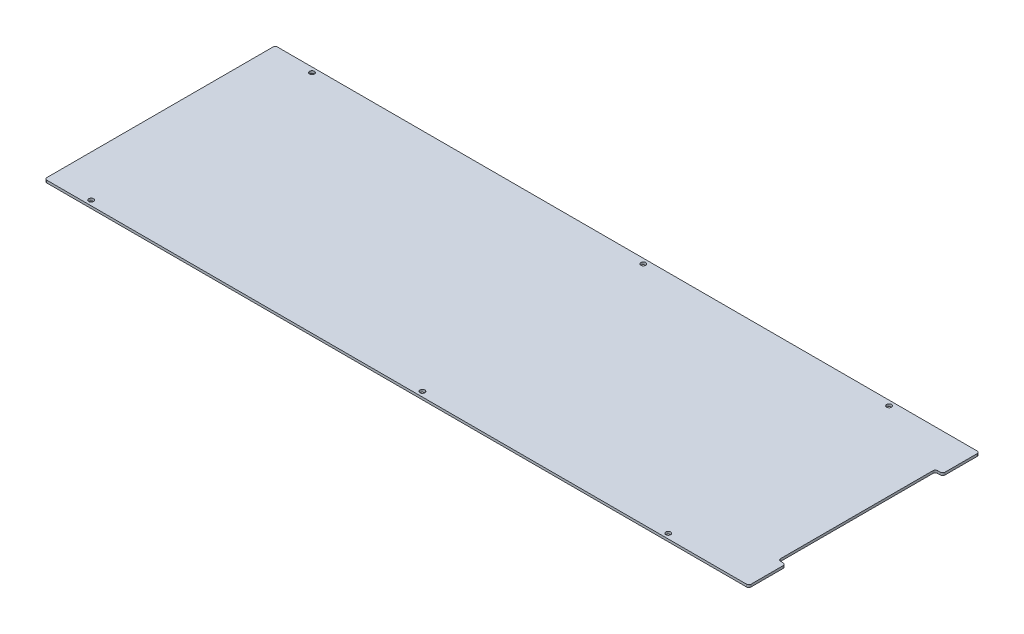
ISO-10303-21;
HEADER;
FILE_DESCRIPTION(('STEP AP214'),'2;1');
FILE_NAME('part.step','',(''),(''),'','','');
FILE_SCHEMA(('AUTOMOTIVE_DESIGN { 1 0 10303 214 1 1 1 1 }'));
ENDSEC;
DATA;
#1=APPLICATION_CONTEXT('core data for automotive mechanical design processes');
#2=APPLICATION_PROTOCOL_DEFINITION('international standard','automotive_design',2000,#1);
#3=PRODUCT_CONTEXT('',#1,'mechanical');
#4=PRODUCT('Part','Part','',(#3));
#5=PRODUCT_RELATED_PRODUCT_CATEGORY('part','',(#4));
#6=PRODUCT_DEFINITION_FORMATION('','',#4);
#7=PRODUCT_DEFINITION_CONTEXT('part definition',#1,'design');
#8=PRODUCT_DEFINITION('design','',#6,#7);
#9=PRODUCT_DEFINITION_SHAPE('','',#8);
#10=(LENGTH_UNIT() NAMED_UNIT(*) SI_UNIT(.MILLI.,.METRE.));
#11=(NAMED_UNIT(*) PLANE_ANGLE_UNIT() SI_UNIT($,.RADIAN.));
#12=(NAMED_UNIT(*) SI_UNIT($,.STERADIAN.) SOLID_ANGLE_UNIT());
#13=UNCERTAINTY_MEASURE_WITH_UNIT(LENGTH_MEASURE(1.E-05),#10,'distance_accuracy_value','');
#14=(GEOMETRIC_REPRESENTATION_CONTEXT(3) GLOBAL_UNCERTAINTY_ASSIGNED_CONTEXT((#13)) GLOBAL_UNIT_ASSIGNED_CONTEXT((#10,
#11,#12)) REPRESENTATION_CONTEXT('',''));
#15=CARTESIAN_POINT('',(0.,0.,0.));
#16=DIRECTION('',(0.,0.,1.));
#17=DIRECTION('',(1.,0.,0.));
#18=AXIS2_PLACEMENT_3D('',#15,#16,#17);
#19=CARTESIAN_POINT('',(455.6125,3.175,149.225));
#20=DIRECTION('',(-1.,0.,0.));
#21=DIRECTION('',(0.,0.,1.));
#22=AXIS2_PLACEMENT_3D('',#19,#20,#21);
#23=PLANE('',#22);
#24=DIRECTION('',(0.,0.,-1.));
#25=VECTOR('',#24,1.);
#26=CARTESIAN_POINT('',(455.6125,3.175,149.225));
#27=LINE('',#26,#25);
#28=CARTESIAN_POINT('',(455.6125,3.175,146.05));
#29=VERTEX_POINT('',#28);
#30=CARTESIAN_POINT('',(455.6125,3.175,104.775));
#31=VERTEX_POINT('',#30);
#32=EDGE_CURVE('E223',#29,#31,#27,.T.);
#33=ORIENTED_EDGE('',*,*,#32,.F.);
#34=DIRECTION('',(0.,-1.,0.));
#35=VECTOR('',#34,1.);
#36=CARTESIAN_POINT('',(455.6125,3.175,146.05));
#37=LINE('',#36,#35);
#38=CARTESIAN_POINT('',(455.6125,0.,146.05));
#39=VERTEX_POINT('',#38);
#40=EDGE_CURVE('E324',#29,#39,#37,.T.);
#41=ORIENTED_EDGE('',*,*,#40,.T.);
#42=DIRECTION('',(0.,0.,-1.));
#43=VECTOR('',#42,1.);
#44=CARTESIAN_POINT('',(455.6125,0.,149.225));
#45=LINE('',#44,#43);
#46=CARTESIAN_POINT('',(455.6125,0.,104.775));
#47=VERTEX_POINT('',#46);
#48=EDGE_CURVE('E238',#39,#47,#45,.T.);
#49=ORIENTED_EDGE('',*,*,#48,.T.);
#50=DIRECTION('',(0.,1.,0.));
#51=VECTOR('',#50,1.);
#52=CARTESIAN_POINT('',(455.6125,3.175,104.775));
#53=LINE('',#52,#51);
#54=EDGE_CURVE('E320',#47,#31,#53,.T.);
#55=ORIENTED_EDGE('',*,*,#54,.T.);
#56=EDGE_LOOP('',(#33,#41,#49,#55));
#57=FACE_BOUND('',#56,.T.);
#58=ADVANCED_FACE('F63',(#57),#23,.F.);
#59=CARTESIAN_POINT('',(455.6125,3.175,-104.775));
#60=VERTEX_POINT('',#59);
#61=CARTESIAN_POINT('',(455.6125,3.175,-146.05));
#62=VERTEX_POINT('',#61);
#63=EDGE_CURVE('E220',#60,#62,#27,.T.);
#64=ORIENTED_EDGE('',*,*,#63,.F.);
#65=DIRECTION('',(0.,1.,0.));
#66=VECTOR('',#65,1.);
#67=CARTESIAN_POINT('',(455.6125,3.175,-104.775));
#68=LINE('',#67,#66);
#69=CARTESIAN_POINT('',(455.6125,0.,-104.775));
#70=VERTEX_POINT('',#69);
#71=EDGE_CURVE('E12',#60,#70,#68,.F.);
#72=ORIENTED_EDGE('',*,*,#71,.T.);
#73=CARTESIAN_POINT('',(455.6125,0.,-146.05));
#74=VERTEX_POINT('',#73);
#75=EDGE_CURVE('E234',#70,#74,#45,.T.);
#76=ORIENTED_EDGE('',*,*,#75,.T.);
#77=DIRECTION('',(0.,-1.,0.));
#78=VECTOR('',#77,1.);
#79=CARTESIAN_POINT('',(455.6125,3.175,-146.05));
#80=LINE('',#79,#78);
#81=EDGE_CURVE('E72',#74,#62,#80,.F.);
#82=ORIENTED_EDGE('',*,*,#81,.T.);
#83=EDGE_LOOP('',(#64,#72,#76,#82));
#84=FACE_BOUND('',#83,.T.);
#85=ADVANCED_FACE('F339',(#84),#23,.F.);
#86=CARTESIAN_POINT('',(-455.6125,3.175,-149.225));
#87=DIRECTION('',(0.,0.,1.));
#88=DIRECTION('',(1.,0.,0.));
#89=AXIS2_PLACEMENT_3D('',#86,#87,#88);
#90=PLANE('',#89);
#91=DIRECTION('',(-1.,0.,0.));
#92=VECTOR('',#91,1.);
#93=CARTESIAN_POINT('',(-455.6125,0.,-149.225));
#94=LINE('',#93,#92);
#95=CARTESIAN_POINT('',(452.4375,0.,-149.225));
#96=VERTEX_POINT('',#95);
#97=CARTESIAN_POINT('',(-452.4375,0.,-149.225));
#98=VERTEX_POINT('',#97);
#99=EDGE_CURVE('E239',#96,#98,#94,.T.);
#100=ORIENTED_EDGE('',*,*,#99,.T.);
#101=DIRECTION('',(0.,-1.,0.));
#102=VECTOR('',#101,1.);
#103=CARTESIAN_POINT('',(-452.4375,3.175,-149.225));
#104=LINE('',#103,#102);
#105=CARTESIAN_POINT('',(-452.4375,3.175,-149.225));
#106=VERTEX_POINT('',#105);
#107=EDGE_CURVE('E79',#98,#106,#104,.F.);
#108=ORIENTED_EDGE('',*,*,#107,.T.);
#109=DIRECTION('',(-1.,0.,0.));
#110=VECTOR('',#109,1.);
#111=CARTESIAN_POINT('',(-455.6125,3.175,-149.225));
#112=LINE('',#111,#110);
#113=CARTESIAN_POINT('',(452.4375,3.175,-149.225));
#114=VERTEX_POINT('',#113);
#115=EDGE_CURVE('E225',#114,#106,#112,.T.);
#116=ORIENTED_EDGE('',*,*,#115,.F.);
#117=DIRECTION('',(0.,-1.,0.));
#118=VECTOR('',#117,1.);
#119=CARTESIAN_POINT('',(452.4375,3.175,-149.225));
#120=LINE('',#119,#118);
#121=EDGE_CURVE('E314',#114,#96,#120,.T.);
#122=ORIENTED_EDGE('',*,*,#121,.T.);
#123=EDGE_LOOP('',(#100,#108,#116,#122));
#124=FACE_BOUND('',#123,.T.);
#125=ADVANCED_FACE('F346',(#124),#90,.F.);
#126=CARTESIAN_POINT('',(-455.6125,3.175,149.225));
#127=DIRECTION('',(1.,0.,0.));
#128=DIRECTION('',(0.,0.,-1.));
#129=AXIS2_PLACEMENT_3D('',#126,#127,#128);
#130=PLANE('',#129);
#131=DIRECTION('',(0.,0.,1.));
#132=VECTOR('',#131,1.);
#133=CARTESIAN_POINT('',(-455.6125,0.,149.225));
#134=LINE('',#133,#132);
#135=CARTESIAN_POINT('',(-455.6125,0.,-146.05));
#136=VERTEX_POINT('',#135);
#137=CARTESIAN_POINT('',(-455.6125,0.,146.05));
#138=VERTEX_POINT('',#137);
#139=EDGE_CURVE('E242',#136,#138,#134,.T.);
#140=ORIENTED_EDGE('',*,*,#139,.T.);
#141=DIRECTION('',(0.,-1.,0.));
#142=VECTOR('',#141,1.);
#143=CARTESIAN_POINT('',(-455.6125,3.175,146.05));
#144=LINE('',#143,#142);
#145=CARTESIAN_POINT('',(-455.6125,3.175,146.05));
#146=VERTEX_POINT('',#145);
#147=EDGE_CURVE('E295',#138,#146,#144,.F.);
#148=ORIENTED_EDGE('',*,*,#147,.T.);
#149=DIRECTION('',(0.,0.,1.));
#150=VECTOR('',#149,1.);
#151=CARTESIAN_POINT('',(-455.6125,3.175,149.225));
#152=LINE('',#151,#150);
#153=CARTESIAN_POINT('',(-455.6125,3.175,-146.05));
#154=VERTEX_POINT('',#153);
#155=EDGE_CURVE('E228',#154,#146,#152,.T.);
#156=ORIENTED_EDGE('',*,*,#155,.F.);
#157=DIRECTION('',(0.,-1.,0.));
#158=VECTOR('',#157,1.);
#159=CARTESIAN_POINT('',(-455.6125,3.175,-146.05));
#160=LINE('',#159,#158);
#161=EDGE_CURVE('E291',#154,#136,#160,.T.);
#162=ORIENTED_EDGE('',*,*,#161,.T.);
#163=EDGE_LOOP('',(#140,#148,#156,#162));
#164=FACE_BOUND('',#163,.T.);
#165=ADVANCED_FACE('F357',(#164),#130,.F.);
#166=CARTESIAN_POINT('',(-455.6125,3.175,149.225));
#167=DIRECTION('',(0.,0.,-1.));
#168=DIRECTION('',(-1.,0.,0.));
#169=AXIS2_PLACEMENT_3D('',#166,#167,#168);
#170=PLANE('',#169);
#171=DIRECTION('',(1.,0.,0.));
#172=VECTOR('',#171,1.);
#173=CARTESIAN_POINT('',(-455.6125,3.175,149.225));
#174=LINE('',#173,#172);
#175=CARTESIAN_POINT('',(-452.4375,3.175,149.225));
#176=VERTEX_POINT('',#175);
#177=CARTESIAN_POINT('',(452.4375,3.175,149.225));
#178=VERTEX_POINT('',#177);
#179=EDGE_CURVE('E201',#176,#178,#174,.T.);
#180=ORIENTED_EDGE('',*,*,#179,.F.);
#181=DIRECTION('',(0.,-1.,0.));
#182=VECTOR('',#181,1.);
#183=CARTESIAN_POINT('',(-452.4375,3.175,149.225));
#184=LINE('',#183,#182);
#185=CARTESIAN_POINT('',(-452.4375,0.,149.225));
#186=VERTEX_POINT('',#185);
#187=EDGE_CURVE('E269',#176,#186,#184,.T.);
#188=ORIENTED_EDGE('',*,*,#187,.T.);
#189=DIRECTION('',(1.,0.,0.));
#190=VECTOR('',#189,1.);
#191=CARTESIAN_POINT('',(-455.6125,0.,149.225));
#192=LINE('',#191,#190);
#193=CARTESIAN_POINT('',(452.4375,0.,149.225));
#194=VERTEX_POINT('',#193);
#195=EDGE_CURVE('E224',#186,#194,#192,.T.);
#196=ORIENTED_EDGE('',*,*,#195,.T.);
#197=DIRECTION('',(0.,-1.,0.));
#198=VECTOR('',#197,1.);
#199=CARTESIAN_POINT('',(452.4375,3.175,149.225));
#200=LINE('',#199,#198);
#201=EDGE_CURVE('E266',#194,#178,#200,.F.);
#202=ORIENTED_EDGE('',*,*,#201,.T.);
#203=EDGE_LOOP('',(#180,#188,#196,#202));
#204=FACE_BOUND('',#203,.T.);
#205=ADVANCED_FACE('F365',(#204),#170,.F.);
#206=CARTESIAN_POINT('',(0.,3.175,0.));
#207=DIRECTION('',(0.,-1.,0.));
#208=DIRECTION('',(0.,0.,-1.));
#209=AXIS2_PLACEMENT_3D('',#206,#207,#208);
#210=PLANE('',#209);
#211=CARTESIAN_POINT('',(345.04884,3.175,142.875));
#212=DIRECTION('',(0.,-1.,0.));
#213=DIRECTION('',(0.,0.,-1.));
#214=AXIS2_PLACEMENT_3D('',#211,#212,#213);
#215=CIRCLE('',#214,3.17499999999998);
#216=CARTESIAN_POINT('',(345.04884,3.175,139.7));
#217=VERTEX_POINT('',#216);
#218=EDGE_CURVE('E442',#217,#217,#215,.T.);
#219=ORIENTED_EDGE('',*,*,#218,.T.);
#220=EDGE_LOOP('',(#219));
#221=FACE_BOUND('',#220,.T.);
#222=CARTESIAN_POINT('',(-401.6375,3.175,142.875));
#223=DIRECTION('',(0.,-1.,0.));
#224=DIRECTION('',(0.,0.,-1.));
#225=AXIS2_PLACEMENT_3D('',#222,#223,#224);
#226=CIRCLE('',#225,3.17499999999998);
#227=CARTESIAN_POINT('',(-401.6375,3.175,139.7));
#228=VERTEX_POINT('',#227);
#229=EDGE_CURVE('E434',#228,#228,#226,.T.);
#230=ORIENTED_EDGE('',*,*,#229,.T.);
#231=EDGE_LOOP('',(#230));
#232=FACE_BOUND('',#231,.T.);
#233=CARTESIAN_POINT('',(26.9875000000001,3.175,142.875));
#234=DIRECTION('',(0.,-1.,0.));
#235=DIRECTION('',(0.,0.,-1.));
#236=AXIS2_PLACEMENT_3D('',#233,#234,#235);
#237=CIRCLE('',#236,3.175);
#238=CARTESIAN_POINT('',(26.9875000000001,3.175,139.7));
#239=VERTEX_POINT('',#238);
#240=EDGE_CURVE('E426',#239,#239,#237,.T.);
#241=ORIENTED_EDGE('',*,*,#240,.T.);
#242=EDGE_LOOP('',(#241));
#243=FACE_BOUND('',#242,.T.);
#244=CARTESIAN_POINT('',(345.04884,3.175,-142.875));
#245=DIRECTION('',(0.,-1.,0.));
#246=DIRECTION('',(0.,0.,-1.));
#247=AXIS2_PLACEMENT_3D('',#244,#245,#246);
#248=CIRCLE('',#247,3.17499999999998);
#249=CARTESIAN_POINT('',(345.04884,3.175,-146.05));
#250=VERTEX_POINT('',#249);
#251=EDGE_CURVE('E418',#250,#250,#248,.T.);
#252=ORIENTED_EDGE('',*,*,#251,.T.);
#253=EDGE_LOOP('',(#252));
#254=FACE_BOUND('',#253,.T.);
#255=CARTESIAN_POINT('',(-401.6375,3.175,-142.875));
#256=DIRECTION('',(0.,-1.,0.));
#257=DIRECTION('',(0.,0.,-1.));
#258=AXIS2_PLACEMENT_3D('',#255,#256,#257);
#259=CIRCLE('',#258,3.17499999999998);
#260=CARTESIAN_POINT('',(-401.6375,3.175,-146.05));
#261=VERTEX_POINT('',#260);
#262=EDGE_CURVE('E408',#261,#261,#259,.T.);
#263=ORIENTED_EDGE('',*,*,#262,.T.);
#264=EDGE_LOOP('',(#263));
#265=FACE_BOUND('',#264,.T.);
#266=CARTESIAN_POINT('',(26.9875000000001,3.175,-142.875));
#267=DIRECTION('',(0.,-1.,0.));
#268=DIRECTION('',(0.,0.,-1.));
#269=AXIS2_PLACEMENT_3D('',#266,#267,#268);
#270=CIRCLE('',#269,3.175);
#271=CARTESIAN_POINT('',(26.9875000000001,3.175,-146.05));
#272=VERTEX_POINT('',#271);
#273=EDGE_CURVE('E397',#272,#272,#270,.T.);
#274=ORIENTED_EDGE('',*,*,#273,.T.);
#275=EDGE_LOOP('',(#274));
#276=FACE_BOUND('',#275,.T.);
#277=ORIENTED_EDGE('',*,*,#155,.T.);
#278=CARTESIAN_POINT('',(-452.4375,3.175,146.05));
#279=DIRECTION('',(0.,-1.,0.));
#280=DIRECTION('',(0.,0.,-1.));
#281=AXIS2_PLACEMENT_3D('',#278,#279,#280);
#282=CIRCLE('',#281,3.175);
#283=EDGE_CURVE('E311',#146,#176,#282,.F.);
#284=ORIENTED_EDGE('',*,*,#283,.T.);
#285=ORIENTED_EDGE('',*,*,#179,.T.);
#286=CARTESIAN_POINT('',(452.4375,3.175,146.05));
#287=DIRECTION('',(0.,-1.,0.));
#288=DIRECTION('',(0.,0.,-1.));
#289=AXIS2_PLACEMENT_3D('',#286,#287,#288);
#290=CIRCLE('',#289,3.175);
#291=EDGE_CURVE('E305',#178,#29,#290,.F.);
#292=ORIENTED_EDGE('',*,*,#291,.T.);
#293=ORIENTED_EDGE('',*,*,#32,.T.);
#294=CARTESIAN_POINT('',(452.4375,3.175,104.775));
#295=DIRECTION('',(0.,-1.,0.));
#296=DIRECTION('',(0.,0.,-1.));
#297=AXIS2_PLACEMENT_3D('',#294,#295,#296);
#298=CIRCLE('',#297,3.175);
#299=CARTESIAN_POINT('',(452.4375,3.175,101.6));
#300=VERTEX_POINT('',#299);
#301=EDGE_CURVE('E206',#31,#300,#298,.F.);
#302=ORIENTED_EDGE('',*,*,#301,.T.);
#303=DIRECTION('',(1.,0.,0.));
#304=VECTOR('',#303,1.);
#305=CARTESIAN_POINT('',(455.6125,3.175,101.6));
#306=LINE('',#305,#304);
#307=CARTESIAN_POINT('',(449.2625,3.175,101.6));
#308=VERTEX_POINT('',#307);
#309=EDGE_CURVE('E195',#308,#300,#306,.T.);
#310=ORIENTED_EDGE('',*,*,#309,.F.);
#311=CARTESIAN_POINT('',(449.2625,3.175,98.425));
#312=DIRECTION('',(0.,-1.,0.));
#313=DIRECTION('',(0.,0.,-1.));
#314=AXIS2_PLACEMENT_3D('',#311,#312,#313);
#315=CIRCLE('',#314,3.175);
#316=CARTESIAN_POINT('',(446.0875,3.175,98.425));
#317=VERTEX_POINT('',#316);
#318=EDGE_CURVE('E178',#308,#317,#315,.T.);
#319=ORIENTED_EDGE('',*,*,#318,.T.);
#320=DIRECTION('',(0.,0.,1.));
#321=VECTOR('',#320,1.);
#322=CARTESIAN_POINT('',(446.0875,3.175,-101.6));
#323=LINE('',#322,#321);
#324=CARTESIAN_POINT('',(446.0875,3.175,-98.425));
#325=VERTEX_POINT('',#324);
#326=EDGE_CURVE('E209',#325,#317,#323,.T.);
#327=ORIENTED_EDGE('',*,*,#326,.F.);
#328=CARTESIAN_POINT('',(449.2625,3.175,-98.425));
#329=DIRECTION('',(0.,-1.,0.));
#330=DIRECTION('',(0.,0.,-1.));
#331=AXIS2_PLACEMENT_3D('',#328,#329,#330);
#332=CIRCLE('',#331,3.175);
#333=CARTESIAN_POINT('',(449.2625,3.175,-101.6));
#334=VERTEX_POINT('',#333);
#335=EDGE_CURVE('E259',#325,#334,#332,.T.);
#336=ORIENTED_EDGE('',*,*,#335,.T.);
#337=DIRECTION('',(-1.,0.,0.));
#338=VECTOR('',#337,1.);
#339=CARTESIAN_POINT('',(455.6125,3.175,-101.6));
#340=LINE('',#339,#338);
#341=CARTESIAN_POINT('',(452.4375,3.175,-101.6));
#342=VERTEX_POINT('',#341);
#343=EDGE_CURVE('E216',#342,#334,#340,.T.);
#344=ORIENTED_EDGE('',*,*,#343,.F.);
#345=CARTESIAN_POINT('',(452.4375,3.175,-104.775));
#346=DIRECTION('',(0.,-1.,0.));
#347=DIRECTION('',(0.,0.,-1.));
#348=AXIS2_PLACEMENT_3D('',#345,#346,#347);
#349=CIRCLE('',#348,3.175);
#350=EDGE_CURVE('E300',#342,#60,#349,.F.);
#351=ORIENTED_EDGE('',*,*,#350,.T.);
#352=ORIENTED_EDGE('',*,*,#63,.T.);
#353=CARTESIAN_POINT('',(452.4375,3.175,-146.05));
#354=DIRECTION('',(0.,-1.,0.));
#355=DIRECTION('',(0.,0.,-1.));
#356=AXIS2_PLACEMENT_3D('',#353,#354,#355);
#357=CIRCLE('',#356,3.175);
#358=EDGE_CURVE('E86',#62,#114,#357,.F.);
#359=ORIENTED_EDGE('',*,*,#358,.T.);
#360=ORIENTED_EDGE('',*,*,#115,.T.);
#361=CARTESIAN_POINT('',(-452.4375,3.175,-146.05));
#362=DIRECTION('',(0.,-1.,0.));
#363=DIRECTION('',(0.,0.,-1.));
#364=AXIS2_PLACEMENT_3D('',#361,#362,#363);
#365=CIRCLE('',#364,3.175);
#366=EDGE_CURVE('E308',#106,#154,#365,.F.);
#367=ORIENTED_EDGE('',*,*,#366,.T.);
#368=EDGE_LOOP('',(#277,#284,#285,#292,#293,#302,#310,#319,#327,#336,#344,#351,#352,#359,#360,#367));
#369=FACE_BOUND('',#368,.T.);
#370=ADVANCED_FACE('F204',(#221,#232,#243,#254,#265,#276,#369),#210,.F.);
#371=CARTESIAN_POINT('',(0.,0.,0.));
#372=DIRECTION('',(0.,-1.,0.));
#373=DIRECTION('',(0.,0.,-1.));
#374=AXIS2_PLACEMENT_3D('',#371,#372,#373);
#375=PLANE('',#374);
#376=CARTESIAN_POINT('',(345.04884,0.,142.875));
#377=DIRECTION('',(0.,-1.,0.));
#378=DIRECTION('',(0.,0.,-1.));
#379=AXIS2_PLACEMENT_3D('',#376,#377,#378);
#380=CIRCLE('',#379,3.17499999999998);
#381=CARTESIAN_POINT('',(345.04884,0.,139.7));
#382=VERTEX_POINT('',#381);
#383=EDGE_CURVE('E446',#382,#382,#380,.T.);
#384=ORIENTED_EDGE('',*,*,#383,.F.);
#385=EDGE_LOOP('',(#384));
#386=FACE_BOUND('',#385,.T.);
#387=CARTESIAN_POINT('',(-401.6375,0.,142.875));
#388=DIRECTION('',(0.,-1.,0.));
#389=DIRECTION('',(0.,0.,-1.));
#390=AXIS2_PLACEMENT_3D('',#387,#388,#389);
#391=CIRCLE('',#390,3.17499999999998);
#392=CARTESIAN_POINT('',(-401.6375,0.,139.7));
#393=VERTEX_POINT('',#392);
#394=EDGE_CURVE('E438',#393,#393,#391,.T.);
#395=ORIENTED_EDGE('',*,*,#394,.F.);
#396=EDGE_LOOP('',(#395));
#397=FACE_BOUND('',#396,.T.);
#398=CARTESIAN_POINT('',(26.9875000000001,0.,142.875));
#399=DIRECTION('',(0.,-1.,0.));
#400=DIRECTION('',(0.,0.,-1.));
#401=AXIS2_PLACEMENT_3D('',#398,#399,#400);
#402=CIRCLE('',#401,3.17499999999999);
#403=CARTESIAN_POINT('',(26.9875000000001,0.,139.7));
#404=VERTEX_POINT('',#403);
#405=EDGE_CURVE('E430',#404,#404,#402,.T.);
#406=ORIENTED_EDGE('',*,*,#405,.F.);
#407=EDGE_LOOP('',(#406));
#408=FACE_BOUND('',#407,.T.);
#409=CARTESIAN_POINT('',(345.04884,0.,-142.875));
#410=DIRECTION('',(0.,-1.,0.));
#411=DIRECTION('',(0.,0.,-1.));
#412=AXIS2_PLACEMENT_3D('',#409,#410,#411);
#413=CIRCLE('',#412,3.17499999999998);
#414=CARTESIAN_POINT('',(345.04884,0.,-146.05));
#415=VERTEX_POINT('',#414);
#416=EDGE_CURVE('E422',#415,#415,#413,.T.);
#417=ORIENTED_EDGE('',*,*,#416,.F.);
#418=EDGE_LOOP('',(#417));
#419=FACE_BOUND('',#418,.T.);
#420=CARTESIAN_POINT('',(-401.6375,0.,-142.875));
#421=DIRECTION('',(0.,-1.,0.));
#422=DIRECTION('',(0.,0.,-1.));
#423=AXIS2_PLACEMENT_3D('',#420,#421,#422);
#424=CIRCLE('',#423,3.17499999999998);
#425=CARTESIAN_POINT('',(-401.6375,0.,-146.05));
#426=VERTEX_POINT('',#425);
#427=EDGE_CURVE('E414',#426,#426,#424,.T.);
#428=ORIENTED_EDGE('',*,*,#427,.F.);
#429=EDGE_LOOP('',(#428));
#430=FACE_BOUND('',#429,.T.);
#431=CARTESIAN_POINT('',(26.9875000000001,0.,-142.875));
#432=DIRECTION('',(0.,-1.,0.));
#433=DIRECTION('',(0.,0.,-1.));
#434=AXIS2_PLACEMENT_3D('',#431,#432,#433);
#435=CIRCLE('',#434,3.17499999999999);
#436=CARTESIAN_POINT('',(26.9875000000001,0.,-146.05));
#437=VERTEX_POINT('',#436);
#438=EDGE_CURVE('E402',#437,#437,#435,.T.);
#439=ORIENTED_EDGE('',*,*,#438,.F.);
#440=EDGE_LOOP('',(#439));
#441=FACE_BOUND('',#440,.T.);
#442=ORIENTED_EDGE('',*,*,#195,.F.);
#443=CARTESIAN_POINT('',(-452.4375,0.,146.05));
#444=DIRECTION('',(0.,-1.,0.));
#445=DIRECTION('',(0.,0.,-1.));
#446=AXIS2_PLACEMENT_3D('',#443,#444,#445);
#447=CIRCLE('',#446,3.175);
#448=EDGE_CURVE('E288',#186,#138,#447,.T.);
#449=ORIENTED_EDGE('',*,*,#448,.T.);
#450=ORIENTED_EDGE('',*,*,#139,.F.);
#451=CARTESIAN_POINT('',(-452.4375,0.,-146.05));
#452=DIRECTION('',(0.,-1.,0.));
#453=DIRECTION('',(0.,0.,-1.));
#454=AXIS2_PLACEMENT_3D('',#451,#452,#453);
#455=CIRCLE('',#454,3.175);
#456=EDGE_CURVE('E285',#136,#98,#455,.T.);
#457=ORIENTED_EDGE('',*,*,#456,.T.);
#458=ORIENTED_EDGE('',*,*,#99,.F.);
#459=CARTESIAN_POINT('',(452.4375,0.,-146.05));
#460=DIRECTION('',(0.,-1.,0.));
#461=DIRECTION('',(0.,0.,-1.));
#462=AXIS2_PLACEMENT_3D('',#459,#460,#461);
#463=CIRCLE('',#462,3.175);
#464=EDGE_CURVE('E273',#96,#74,#463,.T.);
#465=ORIENTED_EDGE('',*,*,#464,.T.);
#466=ORIENTED_EDGE('',*,*,#75,.F.);
#467=CARTESIAN_POINT('',(452.4375,0.,-104.775));
#468=DIRECTION('',(0.,-1.,0.));
#469=DIRECTION('',(0.,0.,-1.));
#470=AXIS2_PLACEMENT_3D('',#467,#468,#469);
#471=CIRCLE('',#470,3.175);
#472=CARTESIAN_POINT('',(452.4375,0.,-101.6));
#473=VERTEX_POINT('',#472);
#474=EDGE_CURVE('E276',#70,#473,#471,.T.);
#475=ORIENTED_EDGE('',*,*,#474,.T.);
#476=DIRECTION('',(-1.,0.,0.));
#477=VECTOR('',#476,1.);
#478=CARTESIAN_POINT('',(455.6125,0.,-101.6));
#479=LINE('',#478,#477);
#480=CARTESIAN_POINT('',(449.2625,0.,-101.6));
#481=VERTEX_POINT('',#480);
#482=EDGE_CURVE('E208',#473,#481,#479,.T.);
#483=ORIENTED_EDGE('',*,*,#482,.T.);
#484=CARTESIAN_POINT('',(449.2625,0.,-98.425));
#485=DIRECTION('',(0.,-1.,0.));
#486=DIRECTION('',(0.,0.,-1.));
#487=AXIS2_PLACEMENT_3D('',#484,#485,#486);
#488=CIRCLE('',#487,3.175);
#489=CARTESIAN_POINT('',(446.0875,0.,-98.425));
#490=VERTEX_POINT('',#489);
#491=EDGE_CURVE('E263',#481,#490,#488,.F.);
#492=ORIENTED_EDGE('',*,*,#491,.T.);
#493=DIRECTION('',(0.,0.,1.));
#494=VECTOR('',#493,1.);
#495=CARTESIAN_POINT('',(446.0875,0.,-101.6));
#496=LINE('',#495,#494);
#497=CARTESIAN_POINT('',(446.0875,0.,98.425));
#498=VERTEX_POINT('',#497);
#499=EDGE_CURVE('E214',#490,#498,#496,.T.);
#500=ORIENTED_EDGE('',*,*,#499,.T.);
#501=CARTESIAN_POINT('',(449.2625,0.,98.425));
#502=DIRECTION('',(0.,-1.,0.));
#503=DIRECTION('',(0.,0.,-1.));
#504=AXIS2_PLACEMENT_3D('',#501,#502,#503);
#505=CIRCLE('',#504,3.175);
#506=CARTESIAN_POINT('',(449.2625,0.,101.6));
#507=VERTEX_POINT('',#506);
#508=EDGE_CURVE('E188',#498,#507,#505,.F.);
#509=ORIENTED_EDGE('',*,*,#508,.T.);
#510=DIRECTION('',(1.,0.,0.));
#511=VECTOR('',#510,1.);
#512=CARTESIAN_POINT('',(455.6125,0.,101.6));
#513=LINE('',#512,#511);
#514=CARTESIAN_POINT('',(452.4375,0.,101.6));
#515=VERTEX_POINT('',#514);
#516=EDGE_CURVE('E198',#507,#515,#513,.T.);
#517=ORIENTED_EDGE('',*,*,#516,.T.);
#518=CARTESIAN_POINT('',(452.4375,0.,104.775));
#519=DIRECTION('',(0.,-1.,0.));
#520=DIRECTION('',(0.,0.,-1.));
#521=AXIS2_PLACEMENT_3D('',#518,#519,#520);
#522=CIRCLE('',#521,3.175);
#523=EDGE_CURVE('E279',#515,#47,#522,.T.);
#524=ORIENTED_EDGE('',*,*,#523,.T.);
#525=ORIENTED_EDGE('',*,*,#48,.F.);
#526=CARTESIAN_POINT('',(452.4375,0.,146.05));
#527=DIRECTION('',(0.,-1.,0.));
#528=DIRECTION('',(0.,0.,-1.));
#529=AXIS2_PLACEMENT_3D('',#526,#527,#528);
#530=CIRCLE('',#529,3.175);
#531=EDGE_CURVE('E282',#39,#194,#530,.T.);
#532=ORIENTED_EDGE('',*,*,#531,.T.);
#533=EDGE_LOOP('',(#442,#449,#450,#457,#458,#465,#466,#475,#483,#492,#500,#509,#517,#524,#525,#532));
#534=FACE_BOUND('',#533,.T.);
#535=ADVANCED_FACE('F349',(#386,#397,#408,#419,#430,#441,#534),#375,.T.);
#536=CARTESIAN_POINT('',(455.6125,0.,101.6));
#537=DIRECTION('',(0.,0.,1.));
#538=DIRECTION('',(1.,0.,0.));
#539=AXIS2_PLACEMENT_3D('',#536,#537,#538);
#540=PLANE('',#539);
#541=ORIENTED_EDGE('',*,*,#309,.T.);
#542=DIRECTION('',(0.,1.,0.));
#543=VECTOR('',#542,1.);
#544=CARTESIAN_POINT('',(452.4375,0.,101.6));
#545=LINE('',#544,#543);
#546=EDGE_CURVE('E328',#300,#515,#545,.F.);
#547=ORIENTED_EDGE('',*,*,#546,.T.);
#548=ORIENTED_EDGE('',*,*,#516,.F.);
#549=DIRECTION('',(0.,1.,0.));
#550=VECTOR('',#549,1.);
#551=CARTESIAN_POINT('',(449.2625,3.175,101.6));
#552=LINE('',#551,#550);
#553=EDGE_CURVE('E182',#507,#308,#552,.T.);
#554=ORIENTED_EDGE('',*,*,#553,.T.);
#555=EDGE_LOOP('',(#541,#547,#548,#554));
#556=FACE_BOUND('',#555,.T.);
#557=ADVANCED_FACE('F194',(#556),#540,.F.);
#558=CARTESIAN_POINT('',(446.0875,0.,-101.6));
#559=DIRECTION('',(-1.,0.,0.));
#560=DIRECTION('',(0.,0.,1.));
#561=AXIS2_PLACEMENT_3D('',#558,#559,#560);
#562=PLANE('',#561);
#563=ORIENTED_EDGE('',*,*,#326,.T.);
#564=DIRECTION('',(0.,1.,0.));
#565=VECTOR('',#564,1.);
#566=CARTESIAN_POINT('',(446.0875,0.,98.425));
#567=LINE('',#566,#565);
#568=EDGE_CURVE('E183',#317,#498,#567,.F.);
#569=ORIENTED_EDGE('',*,*,#568,.T.);
#570=ORIENTED_EDGE('',*,*,#499,.F.);
#571=DIRECTION('',(0.,1.,0.));
#572=VECTOR('',#571,1.);
#573=CARTESIAN_POINT('',(446.0875,3.175,-98.425));
#574=LINE('',#573,#572);
#575=EDGE_CURVE('E200',#490,#325,#574,.T.);
#576=ORIENTED_EDGE('',*,*,#575,.T.);
#577=EDGE_LOOP('',(#563,#569,#570,#576));
#578=FACE_BOUND('',#577,.T.);
#579=ADVANCED_FACE('F516',(#578),#562,.F.);
#580=CARTESIAN_POINT('',(455.6125,0.,-101.6));
#581=DIRECTION('',(0.,0.,-1.));
#582=DIRECTION('',(-1.,0.,0.));
#583=AXIS2_PLACEMENT_3D('',#580,#581,#582);
#584=PLANE('',#583);
#585=ORIENTED_EDGE('',*,*,#482,.F.);
#586=DIRECTION('',(0.,1.,0.));
#587=VECTOR('',#586,1.);
#588=CARTESIAN_POINT('',(452.4375,0.,-101.6));
#589=LINE('',#588,#587);
#590=EDGE_CURVE('E331',#473,#342,#589,.T.);
#591=ORIENTED_EDGE('',*,*,#590,.T.);
#592=ORIENTED_EDGE('',*,*,#343,.T.);
#593=DIRECTION('',(0.,1.,0.));
#594=VECTOR('',#593,1.);
#595=CARTESIAN_POINT('',(449.2625,0.,-101.6));
#596=LINE('',#595,#594);
#597=EDGE_CURVE('E189',#334,#481,#596,.F.);
#598=ORIENTED_EDGE('',*,*,#597,.T.);
#599=EDGE_LOOP('',(#585,#591,#592,#598));
#600=FACE_BOUND('',#599,.T.);
#601=ADVANCED_FACE('F492',(#600),#584,.F.);
#602=CARTESIAN_POINT('',(449.2625,0.,98.425));
#603=DIRECTION('',(0.,-1.,0.));
#604=DIRECTION('',(0.,0.,-1.));
#605=AXIS2_PLACEMENT_3D('',#602,#603,#604);
#606=CYLINDRICAL_SURFACE('',#605,3.175);
#607=ORIENTED_EDGE('',*,*,#508,.F.);
#608=ORIENTED_EDGE('',*,*,#568,.F.);
#609=ORIENTED_EDGE('',*,*,#318,.F.);
#610=ORIENTED_EDGE('',*,*,#553,.F.);
#611=EDGE_LOOP('',(#607,#608,#609,#610));
#612=FACE_BOUND('',#611,.T.);
#613=ADVANCED_FACE('F181',(#612),#606,.F.);
#614=CARTESIAN_POINT('',(449.2625,0.,-98.425));
#615=DIRECTION('',(0.,-1.,0.));
#616=DIRECTION('',(0.,0.,-1.));
#617=AXIS2_PLACEMENT_3D('',#614,#615,#616);
#618=CYLINDRICAL_SURFACE('',#617,3.175);
#619=ORIENTED_EDGE('',*,*,#491,.F.);
#620=ORIENTED_EDGE('',*,*,#597,.F.);
#621=ORIENTED_EDGE('',*,*,#335,.F.);
#622=ORIENTED_EDGE('',*,*,#575,.F.);
#623=EDGE_LOOP('',(#619,#620,#621,#622));
#624=FACE_BOUND('',#623,.T.);
#625=ADVANCED_FACE('F470',(#624),#618,.F.);
#626=CARTESIAN_POINT('',(26.9875000000001,0.,-142.875));
#627=DIRECTION('',(0.,-1.,0.));
#628=DIRECTION('',(0.,0.,-1.));
#629=AXIS2_PLACEMENT_3D('',#626,#627,#628);
#630=CYLINDRICAL_SURFACE('',#629,3.17499999999999);
#631=ORIENTED_EDGE('',*,*,#273,.F.);
#632=EDGE_LOOP('',(#631));
#633=FACE_BOUND('',#632,.T.);
#634=ORIENTED_EDGE('',*,*,#438,.T.);
#635=EDGE_LOOP('',(#634));
#636=FACE_BOUND('',#635,.T.);
#637=ADVANCED_FACE('F467',(#633,#636),#630,.F.);
#638=CARTESIAN_POINT('',(-401.6375,0.,-142.875));
#639=DIRECTION('',(0.,-1.,0.));
#640=DIRECTION('',(0.,0.,-1.));
#641=AXIS2_PLACEMENT_3D('',#638,#639,#640);
#642=CYLINDRICAL_SURFACE('',#641,3.17499999999998);
#643=ORIENTED_EDGE('',*,*,#262,.F.);
#644=EDGE_LOOP('',(#643));
#645=FACE_BOUND('',#644,.T.);
#646=ORIENTED_EDGE('',*,*,#427,.T.);
#647=EDGE_LOOP('',(#646));
#648=FACE_BOUND('',#647,.T.);
#649=ADVANCED_FACE('F469',(#645,#648),#642,.F.);
#650=CARTESIAN_POINT('',(345.04884,0.,-142.875));
#651=DIRECTION('',(0.,-1.,0.));
#652=DIRECTION('',(0.,0.,-1.));
#653=AXIS2_PLACEMENT_3D('',#650,#651,#652);
#654=CYLINDRICAL_SURFACE('',#653,3.17499999999998);
#655=ORIENTED_EDGE('',*,*,#251,.F.);
#656=EDGE_LOOP('',(#655));
#657=FACE_BOUND('',#656,.T.);
#658=ORIENTED_EDGE('',*,*,#416,.T.);
#659=EDGE_LOOP('',(#658));
#660=FACE_BOUND('',#659,.T.);
#661=ADVANCED_FACE('F477',(#657,#660),#654,.F.);
#662=CARTESIAN_POINT('',(26.9875000000001,0.,142.875));
#663=DIRECTION('',(0.,-1.,0.));
#664=DIRECTION('',(0.,0.,-1.));
#665=AXIS2_PLACEMENT_3D('',#662,#663,#664);
#666=CYLINDRICAL_SURFACE('',#665,3.17499999999999);
#667=ORIENTED_EDGE('',*,*,#240,.F.);
#668=EDGE_LOOP('',(#667));
#669=FACE_BOUND('',#668,.T.);
#670=ORIENTED_EDGE('',*,*,#405,.T.);
#671=EDGE_LOOP('',(#670));
#672=FACE_BOUND('',#671,.T.);
#673=ADVANCED_FACE('F565',(#669,#672),#666,.F.);
#674=CARTESIAN_POINT('',(-401.6375,0.,142.875));
#675=DIRECTION('',(0.,-1.,0.));
#676=DIRECTION('',(0.,0.,-1.));
#677=AXIS2_PLACEMENT_3D('',#674,#675,#676);
#678=CYLINDRICAL_SURFACE('',#677,3.17499999999998);
#679=ORIENTED_EDGE('',*,*,#229,.F.);
#680=EDGE_LOOP('',(#679));
#681=FACE_BOUND('',#680,.T.);
#682=ORIENTED_EDGE('',*,*,#394,.T.);
#683=EDGE_LOOP('',(#682));
#684=FACE_BOUND('',#683,.T.);
#685=ADVANCED_FACE('F554',(#681,#684),#678,.F.);
#686=CARTESIAN_POINT('',(345.04884,0.,142.875));
#687=DIRECTION('',(0.,-1.,0.));
#688=DIRECTION('',(0.,0.,-1.));
#689=AXIS2_PLACEMENT_3D('',#686,#687,#688);
#690=CYLINDRICAL_SURFACE('',#689,3.17499999999998);
#691=ORIENTED_EDGE('',*,*,#218,.F.);
#692=EDGE_LOOP('',(#691));
#693=FACE_BOUND('',#692,.T.);
#694=ORIENTED_EDGE('',*,*,#383,.T.);
#695=EDGE_LOOP('',(#694));
#696=FACE_BOUND('',#695,.T.);
#697=ADVANCED_FACE('F452',(#693,#696),#690,.F.);
#698=CARTESIAN_POINT('',(-452.4375,3.175,146.05));
#699=DIRECTION('',(0.,-1.,0.));
#700=DIRECTION('',(0.,0.,-1.));
#701=AXIS2_PLACEMENT_3D('',#698,#699,#700);
#702=CYLINDRICAL_SURFACE('',#701,3.175);
#703=ORIENTED_EDGE('',*,*,#283,.F.);
#704=ORIENTED_EDGE('',*,*,#147,.F.);
#705=ORIENTED_EDGE('',*,*,#448,.F.);
#706=ORIENTED_EDGE('',*,*,#187,.F.);
#707=EDGE_LOOP('',(#703,#704,#705,#706));
#708=FACE_BOUND('',#707,.T.);
#709=ADVANCED_FACE('F363',(#708),#702,.T.);
#710=CARTESIAN_POINT('',(-452.4375,3.175,-146.05));
#711=DIRECTION('',(0.,-1.,0.));
#712=DIRECTION('',(0.,0.,-1.));
#713=AXIS2_PLACEMENT_3D('',#710,#711,#712);
#714=CYLINDRICAL_SURFACE('',#713,3.175);
#715=ORIENTED_EDGE('',*,*,#366,.F.);
#716=ORIENTED_EDGE('',*,*,#107,.F.);
#717=ORIENTED_EDGE('',*,*,#456,.F.);
#718=ORIENTED_EDGE('',*,*,#161,.F.);
#719=EDGE_LOOP('',(#715,#716,#717,#718));
#720=FACE_BOUND('',#719,.T.);
#721=ADVANCED_FACE('F354',(#720),#714,.T.);
#722=CARTESIAN_POINT('',(452.4375,3.175,146.05));
#723=DIRECTION('',(0.,-1.,0.));
#724=DIRECTION('',(0.,0.,-1.));
#725=AXIS2_PLACEMENT_3D('',#722,#723,#724);
#726=CYLINDRICAL_SURFACE('',#725,3.175);
#727=ORIENTED_EDGE('',*,*,#291,.F.);
#728=ORIENTED_EDGE('',*,*,#201,.F.);
#729=ORIENTED_EDGE('',*,*,#531,.F.);
#730=ORIENTED_EDGE('',*,*,#40,.F.);
#731=EDGE_LOOP('',(#727,#728,#729,#730));
#732=FACE_BOUND('',#731,.T.);
#733=ADVANCED_FACE('F372',(#732),#726,.T.);
#734=CARTESIAN_POINT('',(452.4375,3.175,104.775));
#735=DIRECTION('',(0.,1.,0.));
#736=DIRECTION('',(0.,0.,1.));
#737=AXIS2_PLACEMENT_3D('',#734,#735,#736);
#738=CYLINDRICAL_SURFACE('',#737,3.175);
#739=ORIENTED_EDGE('',*,*,#523,.F.);
#740=ORIENTED_EDGE('',*,*,#546,.F.);
#741=ORIENTED_EDGE('',*,*,#301,.F.);
#742=ORIENTED_EDGE('',*,*,#54,.F.);
#743=EDGE_LOOP('',(#739,#740,#741,#742));
#744=FACE_BOUND('',#743,.T.);
#745=ADVANCED_FACE('F500',(#744),#738,.T.);
#746=CARTESIAN_POINT('',(452.4375,0.,-104.775));
#747=DIRECTION('',(0.,1.,0.));
#748=DIRECTION('',(0.,0.,1.));
#749=AXIS2_PLACEMENT_3D('',#746,#747,#748);
#750=CYLINDRICAL_SURFACE('',#749,3.175);
#751=ORIENTED_EDGE('',*,*,#474,.F.);
#752=ORIENTED_EDGE('',*,*,#71,.F.);
#753=ORIENTED_EDGE('',*,*,#350,.F.);
#754=ORIENTED_EDGE('',*,*,#590,.F.);
#755=EDGE_LOOP('',(#751,#752,#753,#754));
#756=FACE_BOUND('',#755,.T.);
#757=ADVANCED_FACE('F502',(#756),#750,.T.);
#758=CARTESIAN_POINT('',(452.4375,3.175,-146.05));
#759=DIRECTION('',(0.,-1.,0.));
#760=DIRECTION('',(0.,0.,-1.));
#761=AXIS2_PLACEMENT_3D('',#758,#759,#760);
#762=CYLINDRICAL_SURFACE('',#761,3.175);
#763=ORIENTED_EDGE('',*,*,#358,.F.);
#764=ORIENTED_EDGE('',*,*,#81,.F.);
#765=ORIENTED_EDGE('',*,*,#464,.F.);
#766=ORIENTED_EDGE('',*,*,#121,.F.);
#767=EDGE_LOOP('',(#763,#764,#765,#766));
#768=FACE_BOUND('',#767,.T.);
#769=ADVANCED_FACE('F65',(#768),#762,.T.);
#770=CLOSED_SHELL('',(#58,#85,#125,#165,#205,#370,#535,#557,#579,#601,#613,#625,#637,#649,#661,
#673,#685,#697,#709,#721,#733,#745,#757,#769));
#771=MANIFOLD_SOLID_BREP('B2',#770);
#772=ADVANCED_BREP_SHAPE_REPRESENTATION('',(#18,#771),#14);
#773=SHAPE_DEFINITION_REPRESENTATION(#9,#772);
ENDSEC;
END-ISO-10303-21;
